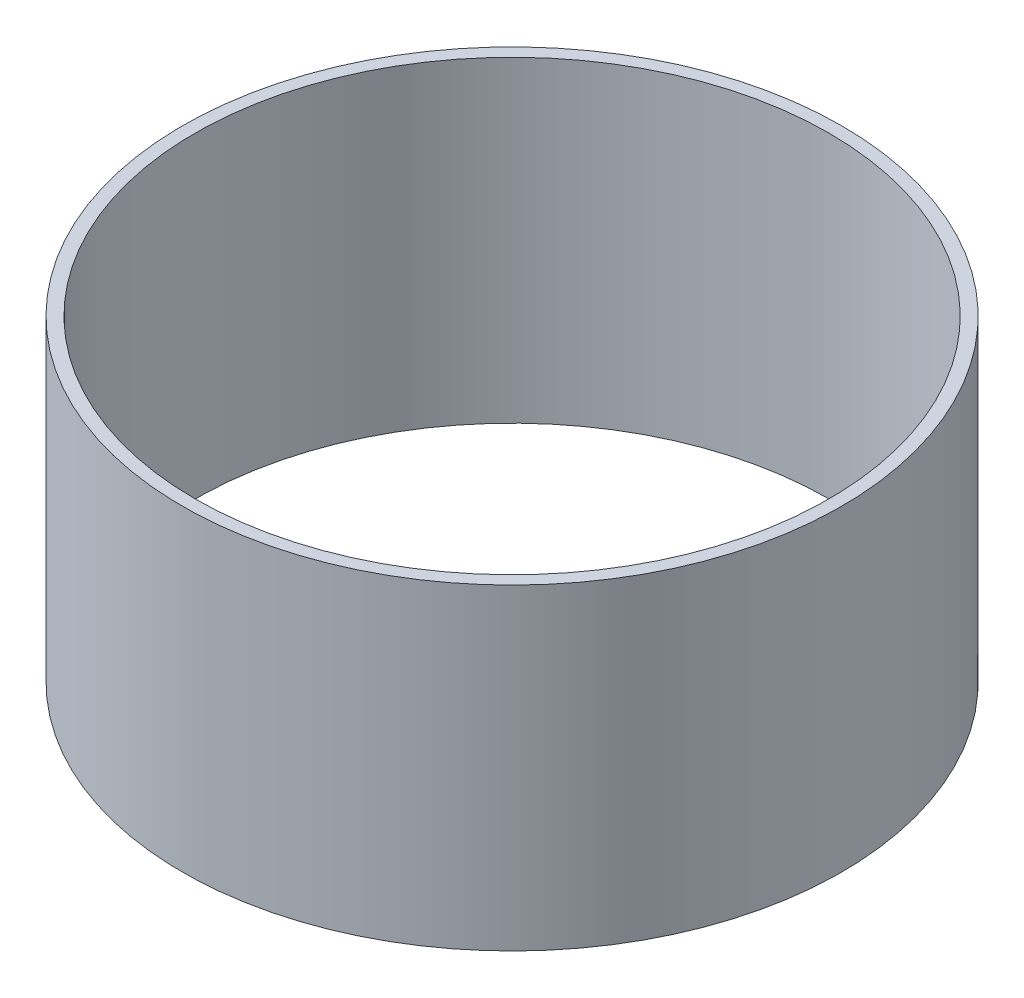
ISO-10303-21;
HEADER;
FILE_DESCRIPTION(('STEP AP214'),'2;1');
FILE_NAME('part.step','',(''),(''),'','','');
FILE_SCHEMA(('AUTOMOTIVE_DESIGN { 1 0 10303 214 1 1 1 1 }'));
ENDSEC;
DATA;
#1=APPLICATION_CONTEXT('core data for automotive mechanical design processes');
#2=APPLICATION_PROTOCOL_DEFINITION('international standard','automotive_design',2000,#1);
#3=PRODUCT_CONTEXT('',#1,'mechanical');
#4=PRODUCT('Part','Part','',(#3));
#5=PRODUCT_RELATED_PRODUCT_CATEGORY('part','',(#4));
#6=PRODUCT_DEFINITION_FORMATION('','',#4);
#7=PRODUCT_DEFINITION_CONTEXT('part definition',#1,'design');
#8=PRODUCT_DEFINITION('design','',#6,#7);
#9=PRODUCT_DEFINITION_SHAPE('','',#8);
#10=(LENGTH_UNIT() NAMED_UNIT(*) SI_UNIT(.MILLI.,.METRE.));
#11=(NAMED_UNIT(*) PLANE_ANGLE_UNIT() SI_UNIT($,.RADIAN.));
#12=(NAMED_UNIT(*) SI_UNIT($,.STERADIAN.) SOLID_ANGLE_UNIT());
#13=UNCERTAINTY_MEASURE_WITH_UNIT(LENGTH_MEASURE(1.E-05),#10,'distance_accuracy_value','');
#14=(GEOMETRIC_REPRESENTATION_CONTEXT(3) GLOBAL_UNCERTAINTY_ASSIGNED_CONTEXT((#13)) GLOBAL_UNIT_ASSIGNED_CONTEXT((#10,
#11,#12)) REPRESENTATION_CONTEXT('',''));
#15=CARTESIAN_POINT('',(0.,0.,0.));
#16=DIRECTION('',(0.,0.,1.));
#17=DIRECTION('',(1.,0.,0.));
#18=AXIS2_PLACEMENT_3D('',#15,#16,#17);
#19=CARTESIAN_POINT('',(0.,38.1,0.));
#20=DIRECTION('',(0.,1.,0.));
#21=DIRECTION('',(0.,0.,1.));
#22=AXIS2_PLACEMENT_3D('',#19,#20,#21);
#23=PLANE('',#22);
#24=CARTESIAN_POINT('',(0.,38.1,0.));
#25=DIRECTION('',(0.,1.,0.));
#26=DIRECTION('',(0.,0.,1.));
#27=AXIS2_PLACEMENT_3D('',#24,#25,#26);
#28=CIRCLE('',#27,39.624);
#29=CARTESIAN_POINT('',(0.,38.1,-39.624));
#30=VERTEX_POINT('',#29);
#31=EDGE_CURVE('E10',#30,#30,#28,.T.);
#32=ORIENTED_EDGE('',*,*,#31,.T.);
#33=EDGE_LOOP('',(#32));
#34=FACE_BOUND('',#33,.T.);
#35=CARTESIAN_POINT('',(0.,38.1,0.));
#36=DIRECTION('',(0.,1.,0.));
#37=DIRECTION('',(0.,0.,1.));
#38=AXIS2_PLACEMENT_3D('',#35,#36,#37);
#39=CIRCLE('',#38,38.1);
#40=CARTESIAN_POINT('',(0.,38.1,-38.1));
#41=VERTEX_POINT('',#40);
#42=EDGE_CURVE('E52',#41,#41,#39,.T.);
#43=ORIENTED_EDGE('',*,*,#42,.F.);
#44=EDGE_LOOP('',(#43));
#45=FACE_BOUND('',#44,.T.);
#46=ADVANCED_FACE('F41',(#34,#45),#23,.T.);
#47=CARTESIAN_POINT('',(0.,0.,0.));
#48=DIRECTION('',(0.,1.,0.));
#49=DIRECTION('',(0.,0.,1.));
#50=AXIS2_PLACEMENT_3D('',#47,#48,#49);
#51=PLANE('',#50);
#52=CARTESIAN_POINT('',(0.,0.,0.));
#53=DIRECTION('',(0.,1.,0.));
#54=DIRECTION('',(0.,0.,1.));
#55=AXIS2_PLACEMENT_3D('',#52,#53,#54);
#56=CIRCLE('',#55,39.624);
#57=CARTESIAN_POINT('',(0.,0.,-39.624));
#58=VERTEX_POINT('',#57);
#59=EDGE_CURVE('E45',#58,#58,#56,.T.);
#60=ORIENTED_EDGE('',*,*,#59,.F.);
#61=EDGE_LOOP('',(#60));
#62=FACE_BOUND('',#61,.T.);
#63=CARTESIAN_POINT('',(0.,0.,0.));
#64=DIRECTION('',(0.,1.,0.));
#65=DIRECTION('',(0.,0.,1.));
#66=AXIS2_PLACEMENT_3D('',#63,#64,#65);
#67=CIRCLE('',#66,38.1);
#68=CARTESIAN_POINT('',(0.,0.,-38.1));
#69=VERTEX_POINT('',#68);
#70=EDGE_CURVE('E54',#69,#69,#67,.T.);
#71=ORIENTED_EDGE('',*,*,#70,.T.);
#72=EDGE_LOOP('',(#71));
#73=FACE_BOUND('',#72,.T.);
#74=ADVANCED_FACE('F64',(#62,#73),#51,.F.);
#75=CARTESIAN_POINT('',(0.,38.1,0.));
#76=DIRECTION('',(0.,-1.,0.));
#77=DIRECTION('',(0.,0.,-1.));
#78=AXIS2_PLACEMENT_3D('',#75,#76,#77);
#79=CYLINDRICAL_SURFACE('',#78,39.624);
#80=CARTESIAN_POINT('',(0.,38.1,-39.624));
#81=CARTESIAN_POINT('',(0.,37.703125,-39.624));
#82=CARTESIAN_POINT('',(0.,37.30625,-39.624));
#83=CARTESIAN_POINT('',(0.,36.5125,-39.624));
#84=CARTESIAN_POINT('',(0.,36.115625,-39.624));
#85=CARTESIAN_POINT('',(0.,35.321875,-39.624));
#86=CARTESIAN_POINT('',(0.,34.925,-39.624));
#87=CARTESIAN_POINT('',(0.,34.13125,-39.624));
#88=CARTESIAN_POINT('',(0.,33.734375,-39.624));
#89=CARTESIAN_POINT('',(0.,32.940625,-39.624));
#90=CARTESIAN_POINT('',(0.,32.54375,-39.624));
#91=CARTESIAN_POINT('',(0.,31.75,-39.624));
#92=CARTESIAN_POINT('',(0.,31.353125,-39.624));
#93=CARTESIAN_POINT('',(0.,30.559375,-39.624));
#94=CARTESIAN_POINT('',(0.,30.1625,-39.624));
#95=CARTESIAN_POINT('',(0.,29.36875,-39.624));
#96=CARTESIAN_POINT('',(0.,28.971875,-39.624));
#97=CARTESIAN_POINT('',(0.,28.178125,-39.624));
#98=CARTESIAN_POINT('',(0.,27.78125,-39.624));
#99=CARTESIAN_POINT('',(0.,26.9875,-39.624));
#100=CARTESIAN_POINT('',(0.,26.590625,-39.624));
#101=CARTESIAN_POINT('',(0.,25.796875,-39.624));
#102=CARTESIAN_POINT('',(0.,25.4,-39.624));
#103=CARTESIAN_POINT('',(0.,24.60625,-39.624));
#104=CARTESIAN_POINT('',(0.,24.209375,-39.624));
#105=CARTESIAN_POINT('',(0.,23.415625,-39.624));
#106=CARTESIAN_POINT('',(0.,23.01875,-39.624));
#107=CARTESIAN_POINT('',(0.,22.225,-39.624));
#108=CARTESIAN_POINT('',(0.,21.828125,-39.624));
#109=CARTESIAN_POINT('',(0.,21.034375,-39.624));
#110=CARTESIAN_POINT('',(0.,20.6375,-39.624));
#111=CARTESIAN_POINT('',(0.,19.84375,-39.624));
#112=CARTESIAN_POINT('',(0.,19.446875,-39.624));
#113=CARTESIAN_POINT('',(0.,18.653125,-39.624));
#114=CARTESIAN_POINT('',(0.,18.25625,-39.624));
#115=CARTESIAN_POINT('',(0.,17.4625,-39.624));
#116=CARTESIAN_POINT('',(0.,17.065625,-39.624));
#117=CARTESIAN_POINT('',(0.,16.271875,-39.624));
#118=CARTESIAN_POINT('',(0.,15.875,-39.624));
#119=CARTESIAN_POINT('',(0.,15.08125,-39.624));
#120=CARTESIAN_POINT('',(0.,14.684375,-39.624));
#121=CARTESIAN_POINT('',(0.,13.890625,-39.624));
#122=CARTESIAN_POINT('',(0.,13.49375,-39.624));
#123=CARTESIAN_POINT('',(0.,12.7,-39.624));
#124=CARTESIAN_POINT('',(0.,12.303125,-39.624));
#125=CARTESIAN_POINT('',(0.,11.509375,-39.624));
#126=CARTESIAN_POINT('',(0.,11.1125,-39.624));
#127=CARTESIAN_POINT('',(0.,10.31875,-39.624));
#128=CARTESIAN_POINT('',(0.,9.92187499999999,-39.624));
#129=CARTESIAN_POINT('',(0.,9.128125,-39.624));
#130=CARTESIAN_POINT('',(0.,8.73124999999999,-39.624));
#131=CARTESIAN_POINT('',(0.,7.93749999999999,-39.624));
#132=CARTESIAN_POINT('',(0.,7.54062499999999,-39.624));
#133=CARTESIAN_POINT('',(0.,6.746875,-39.624));
#134=CARTESIAN_POINT('',(0.,6.35,-39.624));
#135=CARTESIAN_POINT('',(0.,5.55625,-39.624));
#136=CARTESIAN_POINT('',(0.,5.159375,-39.624));
#137=CARTESIAN_POINT('',(0.,4.365625,-39.624));
#138=CARTESIAN_POINT('',(0.,3.96875,-39.624));
#139=CARTESIAN_POINT('',(0.,3.175,-39.624));
#140=CARTESIAN_POINT('',(0.,2.778125,-39.624));
#141=CARTESIAN_POINT('',(0.,1.984375,-39.624));
#142=CARTESIAN_POINT('',(0.,1.5875,-39.624));
#143=CARTESIAN_POINT('',(0.,0.79375,-39.624));
#144=CARTESIAN_POINT('',(0.,0.396875,-39.624));
#145=CARTESIAN_POINT('',(0.,0.,-39.624));
#146=B_SPLINE_CURVE_WITH_KNOTS('',3,(#80,#81,#82,#83,#84,#85,#86,#87,#88,#89,#90,#91,#92,#93,
#94,#95,#96,#97,#98,#99,#100,#101,#102,#103,#104,#105,#106,#107,#108,#109,#110,#111,#112,#113,
#114,#115,#116,#117,#118,#119,#120,#121,#122,#123,#124,#125,#126,#127,#128,#129,#130,#131,#132,
#133,#134,#135,#136,#137,#138,#139,#140,#141,#142,#143,#144,#145),.UNSPECIFIED.,.F.,.F.,(4,2,2,
2,2,2,2,2,2,2,2,2,2,2,2,2,2,2,2,2,2,2,2,2,2,2,2,2,2,2,2,2,4),(0.,1.190625,2.38125,3.571875,
4.7625,5.953125,7.14375,8.334375,9.52500000000001,10.715625,11.90625,13.096875,14.2875,
15.478125,16.66875,17.859375,19.05,20.240625,21.43125,22.621875,23.8125,25.003125,26.19375,
27.384375,28.575,29.765625,30.95625,32.146875,33.3375,34.528125,35.71875,36.909375,38.1),.UNSPECIFIED.);
#147=EDGE_CURVE('BSEAM43',#30,#58,#146,.T.);
#148=ORIENTED_EDGE('',*,*,#31,.F.);
#149=ORIENTED_EDGE('',*,*,#59,.T.);
#150=ORIENTED_EDGE('',*,*,#147,.T.);
#151=ORIENTED_EDGE('',*,*,#147,.F.);
#152=EDGE_LOOP('',(#148,#150,#149,#151));
#153=FACE_BOUND('',#152,.T.);
#154=ADVANCED_FACE('F43',(#153),#79,.T.);
#155=CARTESIAN_POINT('',(0.,38.1,0.));
#156=DIRECTION('',(0.,-1.,0.));
#157=DIRECTION('',(0.,0.,-1.));
#158=AXIS2_PLACEMENT_3D('',#155,#156,#157);
#159=CYLINDRICAL_SURFACE('',#158,38.1);
#160=CARTESIAN_POINT('',(0.,38.1,-38.1));
#161=CARTESIAN_POINT('',(0.,37.703125,-38.1));
#162=CARTESIAN_POINT('',(0.,37.30625,-38.1));
#163=CARTESIAN_POINT('',(0.,36.5125,-38.1));
#164=CARTESIAN_POINT('',(0.,36.115625,-38.1));
#165=CARTESIAN_POINT('',(0.,35.321875,-38.1));
#166=CARTESIAN_POINT('',(0.,34.925,-38.1));
#167=CARTESIAN_POINT('',(0.,34.13125,-38.1));
#168=CARTESIAN_POINT('',(0.,33.734375,-38.1));
#169=CARTESIAN_POINT('',(0.,32.940625,-38.1));
#170=CARTESIAN_POINT('',(0.,32.54375,-38.1));
#171=CARTESIAN_POINT('',(0.,31.75,-38.1));
#172=CARTESIAN_POINT('',(0.,31.353125,-38.1));
#173=CARTESIAN_POINT('',(0.,30.559375,-38.1));
#174=CARTESIAN_POINT('',(0.,30.1625,-38.1));
#175=CARTESIAN_POINT('',(0.,29.36875,-38.1));
#176=CARTESIAN_POINT('',(0.,28.971875,-38.1));
#177=CARTESIAN_POINT('',(0.,28.178125,-38.1));
#178=CARTESIAN_POINT('',(0.,27.78125,-38.1));
#179=CARTESIAN_POINT('',(0.,26.9875,-38.1));
#180=CARTESIAN_POINT('',(0.,26.590625,-38.1));
#181=CARTESIAN_POINT('',(0.,25.796875,-38.1));
#182=CARTESIAN_POINT('',(0.,25.4,-38.1));
#183=CARTESIAN_POINT('',(0.,24.60625,-38.1));
#184=CARTESIAN_POINT('',(0.,24.209375,-38.1));
#185=CARTESIAN_POINT('',(0.,23.415625,-38.1));
#186=CARTESIAN_POINT('',(0.,23.01875,-38.1));
#187=CARTESIAN_POINT('',(0.,22.225,-38.1));
#188=CARTESIAN_POINT('',(0.,21.828125,-38.1));
#189=CARTESIAN_POINT('',(0.,21.034375,-38.1));
#190=CARTESIAN_POINT('',(0.,20.6375,-38.1));
#191=CARTESIAN_POINT('',(0.,19.84375,-38.1));
#192=CARTESIAN_POINT('',(0.,19.446875,-38.1));
#193=CARTESIAN_POINT('',(0.,18.653125,-38.1));
#194=CARTESIAN_POINT('',(0.,18.25625,-38.1));
#195=CARTESIAN_POINT('',(0.,17.4625,-38.1));
#196=CARTESIAN_POINT('',(0.,17.065625,-38.1));
#197=CARTESIAN_POINT('',(0.,16.271875,-38.1));
#198=CARTESIAN_POINT('',(0.,15.875,-38.1));
#199=CARTESIAN_POINT('',(0.,15.08125,-38.1));
#200=CARTESIAN_POINT('',(0.,14.684375,-38.1));
#201=CARTESIAN_POINT('',(0.,13.890625,-38.1));
#202=CARTESIAN_POINT('',(0.,13.49375,-38.1));
#203=CARTESIAN_POINT('',(0.,12.7,-38.1));
#204=CARTESIAN_POINT('',(0.,12.303125,-38.1));
#205=CARTESIAN_POINT('',(0.,11.509375,-38.1));
#206=CARTESIAN_POINT('',(0.,11.1125,-38.1));
#207=CARTESIAN_POINT('',(0.,10.31875,-38.1));
#208=CARTESIAN_POINT('',(0.,9.92187499999999,-38.1));
#209=CARTESIAN_POINT('',(0.,9.128125,-38.1));
#210=CARTESIAN_POINT('',(0.,8.73124999999999,-38.1));
#211=CARTESIAN_POINT('',(0.,7.93749999999999,-38.1));
#212=CARTESIAN_POINT('',(0.,7.54062499999999,-38.1));
#213=CARTESIAN_POINT('',(0.,6.746875,-38.1));
#214=CARTESIAN_POINT('',(0.,6.35,-38.1));
#215=CARTESIAN_POINT('',(0.,5.55625,-38.1));
#216=CARTESIAN_POINT('',(0.,5.159375,-38.1));
#217=CARTESIAN_POINT('',(0.,4.365625,-38.1));
#218=CARTESIAN_POINT('',(0.,3.96875,-38.1));
#219=CARTESIAN_POINT('',(0.,3.175,-38.1));
#220=CARTESIAN_POINT('',(0.,2.778125,-38.1));
#221=CARTESIAN_POINT('',(0.,1.984375,-38.1));
#222=CARTESIAN_POINT('',(0.,1.5875,-38.1));
#223=CARTESIAN_POINT('',(0.,0.79375,-38.1));
#224=CARTESIAN_POINT('',(0.,0.396875,-38.1));
#225=CARTESIAN_POINT('',(0.,0.,-38.1));
#226=B_SPLINE_CURVE_WITH_KNOTS('',3,(#160,#161,#162,#163,#164,#165,#166,#167,#168,#169,#170,
#171,#172,#173,#174,#175,#176,#177,#178,#179,#180,#181,#182,#183,#184,#185,#186,#187,#188,#189,
#190,#191,#192,#193,#194,#195,#196,#197,#198,#199,#200,#201,#202,#203,#204,#205,#206,#207,#208,
#209,#210,#211,#212,#213,#214,#215,#216,#217,#218,#219,#220,#221,#222,#223,#224,#225),
.UNSPECIFIED.,.F.,.F.,(4,2,2,2,2,2,2,2,2,2,2,2,2,2,2,2,2,2,2,2,2,2,2,2,2,2,2,2,2,2,2,2,4),(0.,
1.190625,2.38125,3.571875,4.7625,5.953125,7.14375,8.334375,9.52500000000001,10.715625,11.90625,
13.096875,14.2875,15.478125,16.66875,17.859375,19.05,20.240625,21.43125,22.621875,23.8125,
25.003125,26.19375,27.384375,28.575,29.765625,30.95625,32.146875,33.3375,34.528125,35.71875,
36.909375,38.1),.UNSPECIFIED.);
#227=EDGE_CURVE('BSEAM60',#41,#69,#226,.T.);
#228=ORIENTED_EDGE('',*,*,#42,.T.);
#229=ORIENTED_EDGE('',*,*,#70,.F.);
#230=ORIENTED_EDGE('',*,*,#227,.T.);
#231=ORIENTED_EDGE('',*,*,#227,.F.);
#232=EDGE_LOOP('',(#228,#230,#229,#231));
#233=FACE_BOUND('',#232,.T.);
#234=ADVANCED_FACE('F60',(#233),#159,.F.);
#235=CLOSED_SHELL('',(#46,#74,#154,#234));
#236=MANIFOLD_SOLID_BREP('B2',#235);
#237=ADVANCED_BREP_SHAPE_REPRESENTATION('',(#18,#236),#14);
#238=SHAPE_DEFINITION_REPRESENTATION(#9,#237);
ENDSEC;
END-ISO-10303-21;
